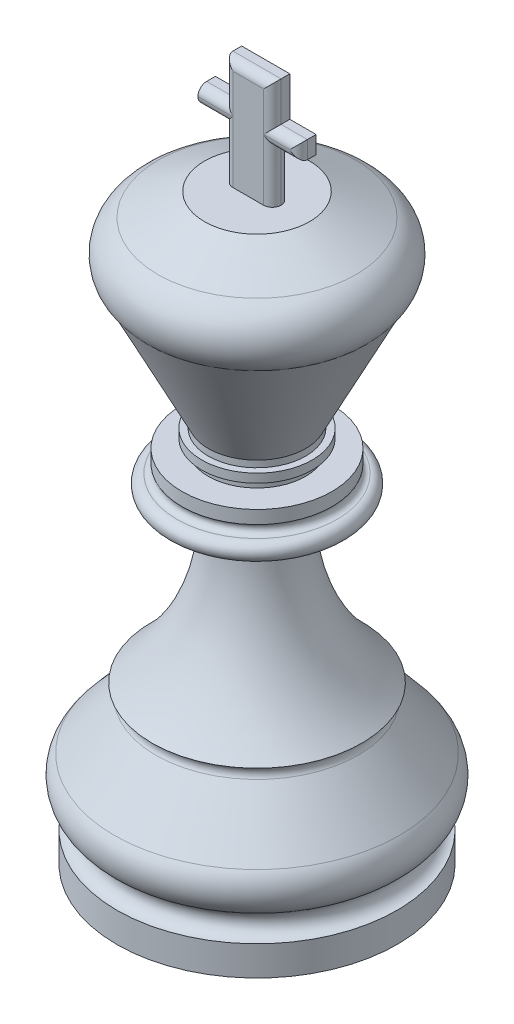
ISO-10303-21;
HEADER;
FILE_DESCRIPTION(('STEP AP214'),'2;1');
FILE_NAME('part.step','',(''),(''),'','','');
FILE_SCHEMA(('AUTOMOTIVE_DESIGN { 1 0 10303 214 1 1 1 1 }'));
ENDSEC;
DATA;
#1=APPLICATION_CONTEXT('core data for automotive mechanical design processes');
#2=APPLICATION_PROTOCOL_DEFINITION('international standard','automotive_design',2000,#1);
#3=PRODUCT_CONTEXT('',#1,'mechanical');
#4=PRODUCT('Part','Part','',(#3));
#5=PRODUCT_RELATED_PRODUCT_CATEGORY('part','',(#4));
#6=PRODUCT_DEFINITION_FORMATION('','',#4);
#7=PRODUCT_DEFINITION_CONTEXT('part definition',#1,'design');
#8=PRODUCT_DEFINITION('design','',#6,#7);
#9=PRODUCT_DEFINITION_SHAPE('','',#8);
#10=(LENGTH_UNIT() NAMED_UNIT(*) SI_UNIT(.MILLI.,.METRE.));
#11=(NAMED_UNIT(*) PLANE_ANGLE_UNIT() SI_UNIT($,.RADIAN.));
#12=(NAMED_UNIT(*) SI_UNIT($,.STERADIAN.) SOLID_ANGLE_UNIT());
#13=UNCERTAINTY_MEASURE_WITH_UNIT(LENGTH_MEASURE(1.E-05),#10,'distance_accuracy_value','');
#14=(GEOMETRIC_REPRESENTATION_CONTEXT(3) GLOBAL_UNCERTAINTY_ASSIGNED_CONTEXT((#13)) GLOBAL_UNIT_ASSIGNED_CONTEXT((#10,
#11,#12)) REPRESENTATION_CONTEXT('',''));
#15=CARTESIAN_POINT('',(0.,0.,0.));
#16=DIRECTION('',(0.,0.,1.));
#17=DIRECTION('',(1.,0.,0.));
#18=AXIS2_PLACEMENT_3D('',#15,#16,#17);
#19=CARTESIAN_POINT('',(0.,0.,0.));
#20=DIRECTION('',(0.,1.,0.));
#21=DIRECTION('',(0.,0.,1.));
#22=AXIS2_PLACEMENT_3D('',#19,#20,#21);
#23=PLANE('',#22);
#24=CARTESIAN_POINT('',(0.,0.,0.));
#25=DIRECTION('',(0.,1.,0.));
#26=DIRECTION('',(0.,0.,1.));
#27=AXIS2_PLACEMENT_3D('',#24,#25,#26);
#28=CIRCLE('',#27,16.);
#29=CARTESIAN_POINT('',(0.,0.,16.));
#30=VERTEX_POINT('',#29);
#31=EDGE_CURVE('E310',#30,#30,#28,.T.);
#32=ORIENTED_EDGE('',*,*,#31,.F.);
#33=EDGE_LOOP('',(#32));
#34=FACE_BOUND('',#33,.T.);
#35=ADVANCED_FACE('F35',(#34),#23,.F.);
#36=CARTESIAN_POINT('',(0.,88.0422171116666,0.));
#37=DIRECTION('',(0.,1.,0.));
#38=DIRECTION('',(0.,0.,1.));
#39=AXIS2_PLACEMENT_3D('',#36,#37,#38);
#40=CYLINDRICAL_SURFACE('',#39,16.);
#41=CARTESIAN_POINT('',(0.,3.38884097967218,0.));
#42=DIRECTION('',(0.,1.,0.));
#43=DIRECTION('',(0.,0.,1.));
#44=AXIS2_PLACEMENT_3D('',#41,#42,#43);
#45=CIRCLE('',#44,16.);
#46=CARTESIAN_POINT('',(0.,3.38884097967218,16.));
#47=VERTEX_POINT('',#46);
#48=EDGE_CURVE('E307',#47,#47,#45,.T.);
#49=ORIENTED_EDGE('',*,*,#48,.F.);
#50=EDGE_LOOP('',(#49));
#51=FACE_BOUND('',#50,.T.);
#52=ORIENTED_EDGE('',*,*,#31,.T.);
#53=EDGE_LOOP('',(#52));
#54=FACE_BOUND('',#53,.T.);
#55=ADVANCED_FACE('F428',(#51,#54),#40,.T.);
#56=CARTESIAN_POINT('',(0.,4.76051124191889,0.));
#57=DIRECTION('',(0.,1.,0.));
#58=DIRECTION('',(0.,0.,1.));
#59=AXIS2_PLACEMENT_3D('',#56,#57,#58);
#60=TOROIDAL_SURFACE('',#59,16.0005608776366,1.37167037691847);
#61=CARTESIAN_POINT('',(0.,5.96490883176661,0.));
#62=DIRECTION('',(0.,1.,0.));
#63=DIRECTION('',(0.,0.,1.));
#64=AXIS2_PLACEMENT_3D('',#61,#62,#63);
#65=CIRCLE('',#64,15.3441265180204);
#66=CARTESIAN_POINT('',(0.,5.96490883176661,15.3441265180204));
#67=VERTEX_POINT('',#66);
#68=EDGE_CURVE('E304',#67,#67,#65,.T.);
#69=ORIENTED_EDGE('',*,*,#68,.F.);
#70=EDGE_LOOP('',(#69));
#71=FACE_BOUND('',#70,.T.);
#72=ORIENTED_EDGE('',*,*,#48,.T.);
#73=EDGE_LOOP('',(#72));
#74=FACE_BOUND('',#73,.T.);
#75=ADVANCED_FACE('F434',(#71,#74),#60,.F.);
#76=CARTESIAN_POINT('',(0.,8.81872198418339,0.));
#77=DIRECTION('',(0.,1.,0.));
#78=DIRECTION('',(0.,0.,1.));
#79=AXIS2_PLACEMENT_3D('',#76,#77,#78);
#80=TOROIDAL_SURFACE('',#79,13.7887090836433,3.25016505797339);
#81=CARTESIAN_POINT('',(0.,10.9194362011423,0.));
#82=DIRECTION('',(0.,1.,0.));
#83=DIRECTION('',(0.,0.,1.));
#84=AXIS2_PLACEMENT_3D('',#81,#82,#83);
#85=CIRCLE('',#84,16.2687438984671);
#86=CARTESIAN_POINT('',(0.,10.9194362011423,16.2687438984671));
#87=VERTEX_POINT('',#86);
#88=EDGE_CURVE('E301',#87,#87,#85,.T.);
#89=ORIENTED_EDGE('',*,*,#88,.F.);
#90=EDGE_LOOP('',(#89));
#91=FACE_BOUND('',#90,.T.);
#92=ORIENTED_EDGE('',*,*,#68,.T.);
#93=EDGE_LOOP('',(#92));
#94=FACE_BOUND('',#93,.T.);
#95=ADVANCED_FACE('F653',(#91,#94),#80,.T.);
#96=CARTESIAN_POINT('',(0.,10.9194362011423,0.));
#97=DIRECTION('',(0.,-1.,0.));
#98=DIRECTION('',(0.,0.,-1.));
#99=AXIS2_PLACEMENT_3D('',#96,#97,#98);
#100=CONICAL_SURFACE('',#99,16.2687438984671,0.702779112860352);
#101=CARTESIAN_POINT('',(0.,16.4939069620984,0.));
#102=DIRECTION('',(0.,1.,0.));
#103=DIRECTION('',(0.,0.,1.));
#104=AXIS2_PLACEMENT_3D('',#101,#102,#103);
#105=CIRCLE('',#104,11.5468868061527);
#106=CARTESIAN_POINT('',(0.,16.4939069620984,11.5468868061527));
#107=VERTEX_POINT('',#106);
#108=EDGE_CURVE('E298',#107,#107,#105,.T.);
#109=ORIENTED_EDGE('',*,*,#108,.F.);
#110=EDGE_LOOP('',(#109));
#111=FACE_BOUND('',#110,.T.);
#112=ORIENTED_EDGE('',*,*,#88,.T.);
#113=EDGE_LOOP('',(#112));
#114=FACE_BOUND('',#113,.T.);
#115=ADVANCED_FACE('F649',(#111,#114),#100,.T.);
#116=CARTESIAN_POINT('',(0.,17.0521890788173,0.));
#117=DIRECTION('',(0.,1.,0.));
#118=DIRECTION('',(0.,0.,1.));
#119=AXIS2_PLACEMENT_3D('',#116,#117,#118);
#120=TOROIDAL_SURFACE('',#119,12.2575928339455,0.903759912692101);
#121=CARTESIAN_POINT('',(0.,17.9144675937287,0.));
#122=DIRECTION('',(0.,1.,0.));
#123=DIRECTION('',(0.,0.,1.));
#124=AXIS2_PLACEMENT_3D('',#121,#122,#123);
#125=CIRCLE('',#124,11.9869311585806);
#126=CARTESIAN_POINT('',(0.,17.9144675937287,11.9869311585806));
#127=VERTEX_POINT('',#126);
#128=EDGE_CURVE('E295',#127,#127,#125,.T.);
#129=ORIENTED_EDGE('',*,*,#128,.F.);
#130=EDGE_LOOP('',(#129));
#131=FACE_BOUND('',#130,.T.);
#132=ORIENTED_EDGE('',*,*,#108,.T.);
#133=EDGE_LOOP('',(#132));
#134=FACE_BOUND('',#133,.T.);
#135=ADVANCED_FACE('F645',(#131,#134),#120,.F.);
#136=CARTESIAN_POINT('',(0.,34.3485931344521,0.));
#137=DIRECTION('',(0.,1.,0.));
#138=DIRECTION('',(0.,0.,1.));
#139=AXIS2_PLACEMENT_3D('',#136,#137,#138);
#140=TOROIDAL_SURFACE('',#139,27.1403266869844,22.3541020470183);
#141=CARTESIAN_POINT('',(0.,36.5901221587112,0.));
#142=DIRECTION('',(0.,1.,0.));
#143=DIRECTION('',(0.,0.,1.));
#144=AXIS2_PLACEMENT_3D('',#141,#142,#143);
#145=CIRCLE('',#144,4.89889179707879);
#146=CARTESIAN_POINT('',(0.,36.5901221587112,4.89889179707879));
#147=VERTEX_POINT('',#146);
#148=EDGE_CURVE('E292',#147,#147,#145,.T.);
#149=ORIENTED_EDGE('',*,*,#148,.F.);
#150=EDGE_LOOP('',(#149));
#151=FACE_BOUND('',#150,.T.);
#152=ORIENTED_EDGE('',*,*,#128,.T.);
#153=EDGE_LOOP('',(#152));
#154=FACE_BOUND('',#153,.T.);
#155=ADVANCED_FACE('F641',(#151,#154),#140,.F.);
#156=CARTESIAN_POINT('',(9.14126090625646,36.5901221587112,0.));
#157=DIRECTION('',(0.,1.,0.));
#158=DIRECTION('',(0.,0.,1.));
#159=AXIS2_PLACEMENT_3D('',#156,#157,#158);
#160=PLANE('',#159);
#161=CARTESIAN_POINT('',(0.,36.5901221587112,0.));
#162=DIRECTION('',(0.,1.,0.));
#163=DIRECTION('',(0.,0.,1.));
#164=AXIS2_PLACEMENT_3D('',#161,#162,#163);
#165=CIRCLE('',#164,9.14126090625646);
#166=CARTESIAN_POINT('',(0.,36.5901221587112,9.14126090625646));
#167=VERTEX_POINT('',#166);
#168=EDGE_CURVE('E289',#167,#167,#165,.T.);
#169=ORIENTED_EDGE('',*,*,#168,.F.);
#170=EDGE_LOOP('',(#169));
#171=FACE_BOUND('',#170,.T.);
#172=ORIENTED_EDGE('',*,*,#148,.T.);
#173=EDGE_LOOP('',(#172));
#174=FACE_BOUND('',#173,.T.);
#175=ADVANCED_FACE('F637',(#171,#174),#160,.F.);
#176=CARTESIAN_POINT('',(0.,37.6051519059904,0.));
#177=DIRECTION('',(0.,1.,0.));
#178=DIRECTION('',(0.,0.,1.));
#179=AXIS2_PLACEMENT_3D('',#176,#177,#178);
#180=TOROIDAL_SURFACE('',#179,9.14126090625646,1.01502974727923);
#181=CARTESIAN_POINT('',(0.,38.6201816532696,0.));
#182=DIRECTION('',(0.,1.,0.));
#183=DIRECTION('',(0.,0.,1.));
#184=AXIS2_PLACEMENT_3D('',#181,#182,#183);
#185=CIRCLE('',#184,9.14126090625646);
#186=CARTESIAN_POINT('',(0.,38.6201816532696,9.14126090625646));
#187=VERTEX_POINT('',#186);
#188=EDGE_CURVE('E286',#187,#187,#185,.T.);
#189=ORIENTED_EDGE('',*,*,#188,.F.);
#190=EDGE_LOOP('',(#189));
#191=FACE_BOUND('',#190,.T.);
#192=ORIENTED_EDGE('',*,*,#168,.T.);
#193=EDGE_LOOP('',(#192));
#194=FACE_BOUND('',#193,.T.);
#195=ADVANCED_FACE('F633',(#191,#194),#180,.T.);
#196=CARTESIAN_POINT('',(0.,39.2468923614205,0.));
#197=DIRECTION('',(0.,1.,0.));
#198=DIRECTION('',(0.,0.,1.));
#199=AXIS2_PLACEMENT_3D('',#196,#197,#198);
#200=TOROIDAL_SURFACE('',#199,9.0913771794894,0.62869284862098);
#201=CARTESIAN_POINT('',(0.,39.5902225928148,0.));
#202=DIRECTION('',(0.,1.,0.));
#203=DIRECTION('',(0.,0.,1.));
#204=AXIS2_PLACEMENT_3D('',#201,#202,#203);
#205=CIRCLE('',#204,8.56470930490627);
#206=CARTESIAN_POINT('',(0.,39.5902225928148,8.56470930490627));
#207=VERTEX_POINT('',#206);
#208=EDGE_CURVE('E283',#207,#207,#205,.T.);
#209=ORIENTED_EDGE('',*,*,#208,.F.);
#210=EDGE_LOOP('',(#209));
#211=FACE_BOUND('',#210,.T.);
#212=ORIENTED_EDGE('',*,*,#188,.T.);
#213=EDGE_LOOP('',(#212));
#214=FACE_BOUND('',#213,.T.);
#215=ADVANCED_FACE('F629',(#211,#214),#200,.F.);
#216=CARTESIAN_POINT('',(0.,88.0422171116666,0.));
#217=DIRECTION('',(0.,1.,0.));
#218=DIRECTION('',(0.,0.,1.));
#219=AXIS2_PLACEMENT_3D('',#216,#217,#218);
#220=CYLINDRICAL_SURFACE('',#219,8.56470930490627);
#221=CARTESIAN_POINT('',(0.,41.0902225928148,0.));
#222=DIRECTION('',(0.,1.,0.));
#223=DIRECTION('',(0.,0.,1.));
#224=AXIS2_PLACEMENT_3D('',#221,#222,#223);
#225=CIRCLE('',#224,8.56470930490627);
#226=CARTESIAN_POINT('',(0.,41.0902225928148,8.56470930490627));
#227=VERTEX_POINT('',#226);
#228=EDGE_CURVE('E280',#227,#227,#225,.T.);
#229=ORIENTED_EDGE('',*,*,#228,.F.);
#230=EDGE_LOOP('',(#229));
#231=FACE_BOUND('',#230,.T.);
#232=ORIENTED_EDGE('',*,*,#208,.T.);
#233=EDGE_LOOP('',(#232));
#234=FACE_BOUND('',#233,.T.);
#235=ADVANCED_FACE('F625',(#231,#234),#220,.T.);
#236=CARTESIAN_POINT('',(5.56470930490627,41.0902225928148,0.));
#237=DIRECTION('',(0.,-1.,0.));
#238=DIRECTION('',(0.,0.,-1.));
#239=AXIS2_PLACEMENT_3D('',#236,#237,#238);
#240=PLANE('',#239);
#241=CARTESIAN_POINT('',(0.,41.0902225928148,0.));
#242=DIRECTION('',(0.,1.,0.));
#243=DIRECTION('',(0.,0.,1.));
#244=AXIS2_PLACEMENT_3D('',#241,#242,#243);
#245=CIRCLE('',#244,5.56470930490627);
#246=CARTESIAN_POINT('',(0.,41.0902225928148,5.56470930490627));
#247=VERTEX_POINT('',#246);
#248=EDGE_CURVE('E277',#247,#247,#245,.T.);
#249=ORIENTED_EDGE('',*,*,#248,.F.);
#250=EDGE_LOOP('',(#249));
#251=FACE_BOUND('',#250,.T.);
#252=ORIENTED_EDGE('',*,*,#228,.T.);
#253=EDGE_LOOP('',(#252));
#254=FACE_BOUND('',#253,.T.);
#255=ADVANCED_FACE('F621',(#251,#254),#240,.F.);
#256=CARTESIAN_POINT('',(0.,88.0422171116666,0.));
#257=DIRECTION('',(0.,1.,0.));
#258=DIRECTION('',(0.,0.,1.));
#259=AXIS2_PLACEMENT_3D('',#256,#257,#258);
#260=CYLINDRICAL_SURFACE('',#259,5.56470930490628);
#261=CARTESIAN_POINT('',(0.,42.0902225928148,0.));
#262=DIRECTION('',(0.,1.,0.));
#263=DIRECTION('',(0.,0.,1.));
#264=AXIS2_PLACEMENT_3D('',#261,#262,#263);
#265=CIRCLE('',#264,5.56470930490628);
#266=CARTESIAN_POINT('',(0.,42.0902225928148,5.56470930490628));
#267=VERTEX_POINT('',#266);
#268=EDGE_CURVE('E274',#267,#267,#265,.T.);
#269=ORIENTED_EDGE('',*,*,#268,.F.);
#270=EDGE_LOOP('',(#269));
#271=FACE_BOUND('',#270,.T.);
#272=ORIENTED_EDGE('',*,*,#248,.T.);
#273=EDGE_LOOP('',(#272));
#274=FACE_BOUND('',#273,.T.);
#275=ADVANCED_FACE('F617',(#271,#274),#260,.T.);
#276=CARTESIAN_POINT('',(6.31470930490628,42.0902225928148,0.));
#277=DIRECTION('',(0.,1.,0.));
#278=DIRECTION('',(0.,0.,1.));
#279=AXIS2_PLACEMENT_3D('',#276,#277,#278);
#280=PLANE('',#279);
#281=CARTESIAN_POINT('',(0.,42.0902225928148,0.));
#282=DIRECTION('',(0.,1.,0.));
#283=DIRECTION('',(0.,0.,1.));
#284=AXIS2_PLACEMENT_3D('',#281,#282,#283);
#285=CIRCLE('',#284,6.31470930490628);
#286=CARTESIAN_POINT('',(0.,42.0902225928148,6.31470930490628));
#287=VERTEX_POINT('',#286);
#288=EDGE_CURVE('E271',#287,#287,#285,.T.);
#289=ORIENTED_EDGE('',*,*,#288,.F.);
#290=EDGE_LOOP('',(#289));
#291=FACE_BOUND('',#290,.T.);
#292=ORIENTED_EDGE('',*,*,#268,.T.);
#293=EDGE_LOOP('',(#292));
#294=FACE_BOUND('',#293,.T.);
#295=ADVANCED_FACE('F613',(#291,#294),#280,.F.);
#296=CARTESIAN_POINT('',(0.,88.0422171116666,0.));
#297=DIRECTION('',(0.,1.,0.));
#298=DIRECTION('',(0.,0.,1.));
#299=AXIS2_PLACEMENT_3D('',#296,#297,#298);
#300=CYLINDRICAL_SURFACE('',#299,6.31470930490628);
#301=CARTESIAN_POINT('',(0.,43.0902225928148,0.));
#302=DIRECTION('',(0.,1.,0.));
#303=DIRECTION('',(0.,0.,1.));
#304=AXIS2_PLACEMENT_3D('',#301,#302,#303);
#305=CIRCLE('',#304,6.31470930490628);
#306=CARTESIAN_POINT('',(0.,43.0902225928148,6.31470930490628));
#307=VERTEX_POINT('',#306);
#308=EDGE_CURVE('E268',#307,#307,#305,.T.);
#309=ORIENTED_EDGE('',*,*,#308,.F.);
#310=EDGE_LOOP('',(#309));
#311=FACE_BOUND('',#310,.T.);
#312=ORIENTED_EDGE('',*,*,#288,.T.);
#313=EDGE_LOOP('',(#312));
#314=FACE_BOUND('',#313,.T.);
#315=ADVANCED_FACE('F609',(#311,#314),#300,.T.);
#316=CARTESIAN_POINT('',(5.56470930490628,43.0902225928148,0.));
#317=DIRECTION('',(0.,-1.,0.));
#318=DIRECTION('',(0.,0.,-1.));
#319=AXIS2_PLACEMENT_3D('',#316,#317,#318);
#320=PLANE('',#319);
#321=CARTESIAN_POINT('',(0.,43.0902225928148,0.));
#322=DIRECTION('',(0.,1.,0.));
#323=DIRECTION('',(0.,0.,1.));
#324=AXIS2_PLACEMENT_3D('',#321,#322,#323);
#325=CIRCLE('',#324,5.56470930490628);
#326=CARTESIAN_POINT('',(0.,43.0902225928148,5.56470930490628));
#327=VERTEX_POINT('',#326);
#328=EDGE_CURVE('E265',#327,#327,#325,.T.);
#329=ORIENTED_EDGE('',*,*,#328,.F.);
#330=EDGE_LOOP('',(#329));
#331=FACE_BOUND('',#330,.T.);
#332=ORIENTED_EDGE('',*,*,#308,.T.);
#333=EDGE_LOOP('',(#332));
#334=FACE_BOUND('',#333,.T.);
#335=ADVANCED_FACE('F605',(#331,#334),#320,.F.);
#336=CARTESIAN_POINT('',(0.,88.0422171116666,0.));
#337=DIRECTION('',(0.,1.,0.));
#338=DIRECTION('',(0.,0.,1.));
#339=AXIS2_PLACEMENT_3D('',#336,#337,#338);
#340=CYLINDRICAL_SURFACE('',#339,5.56470930490628);
#341=CARTESIAN_POINT('',(0.,43.8402225928148,0.));
#342=DIRECTION('',(0.,1.,0.));
#343=DIRECTION('',(0.,0.,1.));
#344=AXIS2_PLACEMENT_3D('',#341,#342,#343);
#345=CIRCLE('',#344,5.56470930490628);
#346=CARTESIAN_POINT('',(0.,43.8402225928148,5.56470930490628));
#347=VERTEX_POINT('',#346);
#348=EDGE_CURVE('E262',#347,#347,#345,.T.);
#349=ORIENTED_EDGE('',*,*,#348,.F.);
#350=EDGE_LOOP('',(#349));
#351=FACE_BOUND('',#350,.T.);
#352=ORIENTED_EDGE('',*,*,#328,.T.);
#353=EDGE_LOOP('',(#352));
#354=FACE_BOUND('',#353,.T.);
#355=ADVANCED_FACE('F601',(#351,#354),#340,.T.);
#356=CARTESIAN_POINT('',(0.,43.8402225928148,0.));
#357=DIRECTION('',(0.,1.,0.));
#358=DIRECTION('',(0.,0.,1.));
#359=AXIS2_PLACEMENT_3D('',#356,#357,#358);
#360=CONICAL_SURFACE('',#359,5.56470930490628,0.465375494081099);
#361=CARTESIAN_POINT('',(0.,57.550572976928,0.));
#362=DIRECTION('',(0.,1.,0.));
#363=DIRECTION('',(0.,0.,1.));
#364=AXIS2_PLACEMENT_3D('',#361,#362,#363);
#365=CIRCLE('',#364,12.4495225193497);
#366=CARTESIAN_POINT('',(0.,57.550572976928,12.4495225193497));
#367=VERTEX_POINT('',#366);
#368=EDGE_CURVE('E259',#367,#367,#365,.T.);
#369=ORIENTED_EDGE('',*,*,#368,.F.);
#370=EDGE_LOOP('',(#369));
#371=FACE_BOUND('',#370,.T.);
#372=ORIENTED_EDGE('',*,*,#348,.T.);
#373=EDGE_LOOP('',(#372));
#374=FACE_BOUND('',#373,.T.);
#375=ADVANCED_FACE('F597',(#371,#374),#360,.T.);
#376=CARTESIAN_POINT('',(0.,60.3214668250883,0.));
#377=DIRECTION('',(0.,1.,0.));
#378=DIRECTION('',(0.,0.,1.));
#379=AXIS2_PLACEMENT_3D('',#376,#377,#378);
#380=TOROIDAL_SURFACE('',#379,9.56470930490627,4.);
#381=CARTESIAN_POINT('',(0.,63.9194386847388,0.));
#382=DIRECTION('',(0.,1.,0.));
#383=DIRECTION('',(0.,0.,1.));
#384=AXIS2_PLACEMENT_3D('',#381,#382,#383);
#385=CIRCLE('',#384,11.3124502746047);
#386=CARTESIAN_POINT('',(0.,63.9194386847388,11.3124502746047));
#387=VERTEX_POINT('',#386);
#388=EDGE_CURVE('E256',#387,#387,#385,.T.);
#389=ORIENTED_EDGE('',*,*,#388,.F.);
#390=EDGE_LOOP('',(#389));
#391=FACE_BOUND('',#390,.T.);
#392=ORIENTED_EDGE('',*,*,#368,.T.);
#393=EDGE_LOOP('',(#392));
#394=FACE_BOUND('',#393,.T.);
#395=ADVANCED_FACE('F593',(#391,#394),#380,.T.);
#396=CARTESIAN_POINT('',(0.,63.9194386847388,0.));
#397=DIRECTION('',(0.,-1.,0.));
#398=DIRECTION('',(0.,0.,-1.));
#399=AXIS2_PLACEMENT_3D('',#396,#397,#398);
#400=CONICAL_SURFACE('',#399,11.3124502746047,1.1186076900031);
#401=CARTESIAN_POINT('',(0.,66.5,0.));
#402=DIRECTION('',(0.,1.,0.));
#403=DIRECTION('',(0.,0.,1.));
#404=AXIS2_PLACEMENT_3D('',#401,#402,#403);
#405=CIRCLE('',#404,6.);
#406=CARTESIAN_POINT('',(0.,66.5,6.));
#407=VERTEX_POINT('',#406);
#408=EDGE_CURVE('E228',#407,#407,#405,.T.);
#409=ORIENTED_EDGE('',*,*,#408,.F.);
#410=EDGE_LOOP('',(#409));
#411=FACE_BOUND('',#410,.T.);
#412=ORIENTED_EDGE('',*,*,#388,.T.);
#413=EDGE_LOOP('',(#412));
#414=FACE_BOUND('',#413,.T.);
#415=ADVANCED_FACE('F590',(#411,#414),#400,.T.);
#416=CARTESIAN_POINT('',(6.,66.5,0.));
#417=DIRECTION('',(0.,-1.,0.));
#418=DIRECTION('',(0.,0.,-1.));
#419=AXIS2_PLACEMENT_3D('',#416,#417,#418);
#420=PLANE('',#419);
#421=DIRECTION('',(1.,0.,0.));
#422=VECTOR('',#421,1.);
#423=CARTESIAN_POINT('',(-2.75,66.5,-1.));
#424=LINE('',#423,#422);
#425=CARTESIAN_POINT('',(-2.75,66.5,-1.));
#426=VERTEX_POINT('',#425);
#427=CARTESIAN_POINT('',(1.75,66.5,-1.));
#428=VERTEX_POINT('',#427);
#429=EDGE_CURVE('E214',#426,#428,#424,.T.);
#430=ORIENTED_EDGE('',*,*,#429,.T.);
#431=CARTESIAN_POINT('',(1.75,66.5,0.));
#432=DIRECTION('',(0.,-1.,0.));
#433=DIRECTION('',(0.,0.,-1.));
#434=AXIS2_PLACEMENT_3D('',#431,#432,#433);
#435=CIRCLE('',#434,1.);
#436=CARTESIAN_POINT('',(2.75,66.5,0.));
#437=VERTEX_POINT('',#436);
#438=EDGE_CURVE('E45',#428,#437,#435,.T.);
#439=ORIENTED_EDGE('',*,*,#438,.T.);
#440=CARTESIAN_POINT('',(1.75,66.5,0.));
#441=DIRECTION('',(0.,-1.,0.));
#442=DIRECTION('',(0.,0.,-1.));
#443=AXIS2_PLACEMENT_3D('',#440,#441,#442);
#444=CIRCLE('',#443,1.);
#445=CARTESIAN_POINT('',(1.75,66.5,1.));
#446=VERTEX_POINT('',#445);
#447=EDGE_CURVE('E11',#437,#446,#444,.T.);
#448=ORIENTED_EDGE('',*,*,#447,.T.);
#449=DIRECTION('',(1.,0.,0.));
#450=VECTOR('',#449,1.);
#451=CARTESIAN_POINT('',(-2.75,66.5,1.));
#452=LINE('',#451,#450);
#453=CARTESIAN_POINT('',(-1.75,66.5,1.));
#454=VERTEX_POINT('',#453);
#455=EDGE_CURVE('E187',#454,#446,#452,.T.);
#456=ORIENTED_EDGE('',*,*,#455,.F.);
#457=CARTESIAN_POINT('',(-1.75,66.5,0.));
#458=DIRECTION('',(0.,-1.,0.));
#459=DIRECTION('',(0.,0.,-1.));
#460=AXIS2_PLACEMENT_3D('',#457,#458,#459);
#461=CIRCLE('',#460,1.);
#462=CARTESIAN_POINT('',(-2.75,66.5,0.));
#463=VERTEX_POINT('',#462);
#464=EDGE_CURVE('E344',#454,#463,#461,.T.);
#465=ORIENTED_EDGE('',*,*,#464,.T.);
#466=DIRECTION('',(0.,0.,1.));
#467=VECTOR('',#466,1.);
#468=CARTESIAN_POINT('',(-2.75,66.5,-1.));
#469=LINE('',#468,#467);
#470=EDGE_CURVE('E235',#426,#463,#469,.T.);
#471=ORIENTED_EDGE('',*,*,#470,.F.);
#472=EDGE_LOOP('',(#430,#439,#448,#456,#465,#471));
#473=FACE_BOUND('',#472,.T.);
#474=ORIENTED_EDGE('',*,*,#408,.T.);
#475=EDGE_LOOP('',(#474));
#476=FACE_BOUND('',#475,.T.);
#477=ADVANCED_FACE('F405',(#473,#476),#420,.F.);
#478=CARTESIAN_POINT('',(2.75,74.5,-1.));
#479=DIRECTION('',(1.,0.,0.));
#480=DIRECTION('',(0.,1.,0.));
#481=AXIS2_PLACEMENT_3D('',#478,#479,#480);
#482=PLANE('',#481);
#483=DIRECTION('',(0.,0.,1.));
#484=VECTOR('',#483,1.);
#485=CARTESIAN_POINT('',(2.75,79.,-1.));
#486=LINE('',#485,#484);
#487=CARTESIAN_POINT('',(2.75,79.,-1.));
#488=VERTEX_POINT('',#487);
#489=CARTESIAN_POINT('',(2.75,79.,0.));
#490=VERTEX_POINT('',#489);
#491=EDGE_CURVE('E144',#488,#490,#486,.T.);
#492=ORIENTED_EDGE('',*,*,#491,.T.);
#493=DIRECTION('',(0.,1.,0.));
#494=VECTOR('',#493,1.);
#495=CARTESIAN_POINT('',(2.75,74.5,0.));
#496=LINE('',#495,#494);
#497=CARTESIAN_POINT('',(2.75,74.5,0.));
#498=VERTEX_POINT('',#497);
#499=EDGE_CURVE('E336',#490,#498,#496,.F.);
#500=ORIENTED_EDGE('',*,*,#499,.T.);
#501=DIRECTION('',(0.,0.,1.));
#502=VECTOR('',#501,1.);
#503=CARTESIAN_POINT('',(2.75,74.5,-1.));
#504=LINE('',#503,#502);
#505=CARTESIAN_POINT('',(2.75,74.5,-1.));
#506=VERTEX_POINT('',#505);
#507=EDGE_CURVE('E225',#506,#498,#504,.T.);
#508=ORIENTED_EDGE('',*,*,#507,.F.);
#509=DIRECTION('',(0.,1.,0.));
#510=VECTOR('',#509,1.);
#511=CARTESIAN_POINT('',(2.75,74.5,-1.));
#512=LINE('',#511,#510);
#513=EDGE_CURVE('E189',#506,#488,#512,.T.);
#514=ORIENTED_EDGE('',*,*,#513,.T.);
#515=EDGE_LOOP('',(#492,#500,#508,#514));
#516=FACE_BOUND('',#515,.T.);
#517=ADVANCED_FACE('F372',(#516),#482,.T.);
#518=CARTESIAN_POINT('',(5.75,74.5,-1.));
#519=DIRECTION('',(0.,1.,0.));
#520=DIRECTION('',(0.,0.,1.));
#521=AXIS2_PLACEMENT_3D('',#518,#519,#520);
#522=PLANE('',#521);
#523=ORIENTED_EDGE('',*,*,#507,.T.);
#524=DIRECTION('',(-1.,0.,0.));
#525=VECTOR('',#524,1.);
#526=CARTESIAN_POINT('',(5.75,74.5,0.));
#527=LINE('',#526,#525);
#528=CARTESIAN_POINT('',(5.75,74.5,0.));
#529=VERTEX_POINT('',#528);
#530=EDGE_CURVE('E338',#498,#529,#527,.F.);
#531=ORIENTED_EDGE('',*,*,#530,.T.);
#532=DIRECTION('',(0.,0.,1.));
#533=VECTOR('',#532,1.);
#534=CARTESIAN_POINT('',(5.75,74.5,-1.));
#535=LINE('',#534,#533);
#536=CARTESIAN_POINT('',(5.75,74.5,-1.));
#537=VERTEX_POINT('',#536);
#538=EDGE_CURVE('E229',#537,#529,#535,.T.);
#539=ORIENTED_EDGE('',*,*,#538,.F.);
#540=DIRECTION('',(-1.,0.,0.));
#541=VECTOR('',#540,1.);
#542=CARTESIAN_POINT('',(5.75,74.5,-1.));
#543=LINE('',#542,#541);
#544=EDGE_CURVE('E222',#537,#506,#543,.T.);
#545=ORIENTED_EDGE('',*,*,#544,.T.);
#546=EDGE_LOOP('',(#523,#531,#539,#545));
#547=FACE_BOUND('',#546,.T.);
#548=ADVANCED_FACE('F375',(#547),#522,.T.);
#549=CARTESIAN_POINT('',(5.75,72.5,-1.));
#550=DIRECTION('',(1.,0.,0.));
#551=DIRECTION('',(0.,0.,-1.));
#552=AXIS2_PLACEMENT_3D('',#549,#550,#551);
#553=PLANE('',#552);
#554=ORIENTED_EDGE('',*,*,#538,.T.);
#555=DIRECTION('',(0.,1.,0.));
#556=VECTOR('',#555,1.);
#557=CARTESIAN_POINT('',(5.75,72.5,0.));
#558=LINE('',#557,#556);
#559=CARTESIAN_POINT('',(5.75,72.5,0.));
#560=VERTEX_POINT('',#559);
#561=EDGE_CURVE('E165',#529,#560,#558,.F.);
#562=ORIENTED_EDGE('',*,*,#561,.T.);
#563=DIRECTION('',(0.,0.,1.));
#564=VECTOR('',#563,1.);
#565=CARTESIAN_POINT('',(5.75,72.5,-1.));
#566=LINE('',#565,#564);
#567=CARTESIAN_POINT('',(5.75,72.5,-1.));
#568=VERTEX_POINT('',#567);
#569=EDGE_CURVE('E232',#568,#560,#566,.T.);
#570=ORIENTED_EDGE('',*,*,#569,.F.);
#571=DIRECTION('',(0.,1.,0.));
#572=VECTOR('',#571,1.);
#573=CARTESIAN_POINT('',(5.75,72.5,-1.));
#574=LINE('',#573,#572);
#575=EDGE_CURVE('E219',#568,#537,#574,.T.);
#576=ORIENTED_EDGE('',*,*,#575,.T.);
#577=EDGE_LOOP('',(#554,#562,#570,#576));
#578=FACE_BOUND('',#577,.T.);
#579=ADVANCED_FACE('F472',(#578),#553,.T.);
#580=CARTESIAN_POINT('',(2.75,72.5,-1.));
#581=DIRECTION('',(0.,-1.,0.));
#582=DIRECTION('',(1.,0.,0.));
#583=AXIS2_PLACEMENT_3D('',#580,#581,#582);
#584=PLANE('',#583);
#585=ORIENTED_EDGE('',*,*,#569,.T.);
#586=DIRECTION('',(1.,0.,0.));
#587=VECTOR('',#586,1.);
#588=CARTESIAN_POINT('',(2.75,72.5,0.));
#589=LINE('',#588,#587);
#590=CARTESIAN_POINT('',(2.75,72.5,0.));
#591=VERTEX_POINT('',#590);
#592=EDGE_CURVE('E158',#560,#591,#589,.F.);
#593=ORIENTED_EDGE('',*,*,#592,.T.);
#594=CARTESIAN_POINT('',(1.75,72.5,0.));
#595=DIRECTION('',(0.,-1.,0.));
#596=DIRECTION('',(1.,0.,0.));
#597=AXIS2_PLACEMENT_3D('',#594,#595,#596);
#598=CIRCLE('',#597,1.);
#599=CARTESIAN_POINT('',(1.75,72.5,-1.));
#600=VERTEX_POINT('',#599);
#601=EDGE_CURVE('E346',#591,#600,#598,.F.);
#602=ORIENTED_EDGE('',*,*,#601,.T.);
#603=DIRECTION('',(1.,0.,0.));
#604=VECTOR('',#603,1.);
#605=CARTESIAN_POINT('',(2.75,72.5,-1.));
#606=LINE('',#605,#604);
#607=EDGE_CURVE('E216',#600,#568,#606,.T.);
#608=ORIENTED_EDGE('',*,*,#607,.T.);
#609=EDGE_LOOP('',(#585,#593,#602,#608));
#610=FACE_BOUND('',#609,.T.);
#611=ADVANCED_FACE('F475',(#610),#584,.T.);
#612=CARTESIAN_POINT('',(-2.75,66.5,-1.));
#613=DIRECTION('',(-1.,0.,0.));
#614=DIRECTION('',(0.,-1.,0.));
#615=AXIS2_PLACEMENT_3D('',#612,#613,#614);
#616=PLANE('',#615);
#617=ORIENTED_EDGE('',*,*,#470,.T.);
#618=DIRECTION('',(0.,-1.,0.));
#619=VECTOR('',#618,1.);
#620=CARTESIAN_POINT('',(-2.75,72.5,0.));
#621=LINE('',#620,#619);
#622=CARTESIAN_POINT('',(-2.75,72.5,0.));
#623=VERTEX_POINT('',#622);
#624=EDGE_CURVE('E322',#463,#623,#621,.F.);
#625=ORIENTED_EDGE('',*,*,#624,.T.);
#626=DIRECTION('',(0.,0.,1.));
#627=VECTOR('',#626,1.);
#628=CARTESIAN_POINT('',(-2.75,72.5,-1.));
#629=LINE('',#628,#627);
#630=CARTESIAN_POINT('',(-2.75,72.5,-1.));
#631=VERTEX_POINT('',#630);
#632=EDGE_CURVE('E238',#631,#623,#629,.T.);
#633=ORIENTED_EDGE('',*,*,#632,.F.);
#634=DIRECTION('',(0.,-1.,0.));
#635=VECTOR('',#634,1.);
#636=CARTESIAN_POINT('',(-2.75,66.5,-1.));
#637=LINE('',#636,#635);
#638=EDGE_CURVE('E211',#631,#426,#637,.T.);
#639=ORIENTED_EDGE('',*,*,#638,.T.);
#640=EDGE_LOOP('',(#617,#625,#633,#639));
#641=FACE_BOUND('',#640,.T.);
#642=ADVANCED_FACE('F409',(#641),#616,.T.);
#643=CARTESIAN_POINT('',(-2.75,72.5,-1.));
#644=DIRECTION('',(0.,-1.,0.));
#645=DIRECTION('',(0.,0.,-1.));
#646=AXIS2_PLACEMENT_3D('',#643,#644,#645);
#647=PLANE('',#646);
#648=ORIENTED_EDGE('',*,*,#632,.T.);
#649=DIRECTION('',(1.,0.,0.));
#650=VECTOR('',#649,1.);
#651=CARTESIAN_POINT('',(-5.75,72.5,0.));
#652=LINE('',#651,#650);
#653=CARTESIAN_POINT('',(-5.75,72.5,0.));
#654=VERTEX_POINT('',#653);
#655=EDGE_CURVE('E324',#623,#654,#652,.F.);
#656=ORIENTED_EDGE('',*,*,#655,.T.);
#657=DIRECTION('',(0.,0.,1.));
#658=VECTOR('',#657,1.);
#659=CARTESIAN_POINT('',(-5.75,72.5,-1.));
#660=LINE('',#659,#658);
#661=CARTESIAN_POINT('',(-5.75,72.5,-1.));
#662=VERTEX_POINT('',#661);
#663=EDGE_CURVE('E241',#662,#654,#660,.T.);
#664=ORIENTED_EDGE('',*,*,#663,.F.);
#665=DIRECTION('',(1.,0.,0.));
#666=VECTOR('',#665,1.);
#667=CARTESIAN_POINT('',(-2.75,72.5,-1.));
#668=LINE('',#667,#666);
#669=EDGE_CURVE('E208',#662,#631,#668,.T.);
#670=ORIENTED_EDGE('',*,*,#669,.T.);
#671=EDGE_LOOP('',(#648,#656,#664,#670));
#672=FACE_BOUND('',#671,.T.);
#673=ADVANCED_FACE('F414',(#672),#647,.T.);
#674=CARTESIAN_POINT('',(-5.75,72.5,-1.));
#675=DIRECTION('',(-1.,0.,0.));
#676=DIRECTION('',(0.,0.,1.));
#677=AXIS2_PLACEMENT_3D('',#674,#675,#676);
#678=PLANE('',#677);
#679=ORIENTED_EDGE('',*,*,#663,.T.);
#680=CARTESIAN_POINT('',(-5.75,73.5,0.));
#681=DIRECTION('',(-1.,0.,0.));
#682=DIRECTION('',(0.,0.,1.));
#683=AXIS2_PLACEMENT_3D('',#680,#681,#682);
#684=CIRCLE('',#683,1.);
#685=CARTESIAN_POINT('',(-5.75,73.5,1.));
#686=VERTEX_POINT('',#685);
#687=EDGE_CURVE('E328',#654,#686,#684,.T.);
#688=ORIENTED_EDGE('',*,*,#687,.T.);
#689=CARTESIAN_POINT('',(-5.75,73.5,0.));
#690=DIRECTION('',(-1.,0.,0.));
#691=DIRECTION('',(0.,0.,1.));
#692=AXIS2_PLACEMENT_3D('',#689,#690,#691);
#693=CIRCLE('',#692,1.);
#694=CARTESIAN_POINT('',(-5.75,74.5,0.));
#695=VERTEX_POINT('',#694);
#696=EDGE_CURVE('E326',#686,#695,#693,.T.);
#697=ORIENTED_EDGE('',*,*,#696,.T.);
#698=DIRECTION('',(0.,0.,1.));
#699=VECTOR('',#698,1.);
#700=CARTESIAN_POINT('',(-5.75,74.5,-1.));
#701=LINE('',#700,#699);
#702=CARTESIAN_POINT('',(-5.75,74.5,-1.));
#703=VERTEX_POINT('',#702);
#704=EDGE_CURVE('E244',#703,#695,#701,.T.);
#705=ORIENTED_EDGE('',*,*,#704,.F.);
#706=DIRECTION('',(0.,-1.,0.));
#707=VECTOR('',#706,1.);
#708=CARTESIAN_POINT('',(-5.75,72.5,-1.));
#709=LINE('',#708,#707);
#710=EDGE_CURVE('E205',#703,#662,#709,.T.);
#711=ORIENTED_EDGE('',*,*,#710,.T.);
#712=EDGE_LOOP('',(#679,#688,#697,#705,#711));
#713=FACE_BOUND('',#712,.T.);
#714=ADVANCED_FACE('F416',(#713),#678,.T.);
#715=CARTESIAN_POINT('',(-5.75,74.5,-1.));
#716=DIRECTION('',(0.,1.,0.));
#717=DIRECTION('',(0.,0.,1.));
#718=AXIS2_PLACEMENT_3D('',#715,#716,#717);
#719=PLANE('',#718);
#720=ORIENTED_EDGE('',*,*,#704,.T.);
#721=DIRECTION('',(-1.,0.,0.));
#722=VECTOR('',#721,1.);
#723=CARTESIAN_POINT('',(-2.75,74.5,0.));
#724=LINE('',#723,#722);
#725=CARTESIAN_POINT('',(-2.75,74.5,0.));
#726=VERTEX_POINT('',#725);
#727=EDGE_CURVE('E330',#695,#726,#724,.F.);
#728=ORIENTED_EDGE('',*,*,#727,.T.);
#729=DIRECTION('',(0.,0.,1.));
#730=VECTOR('',#729,1.);
#731=CARTESIAN_POINT('',(-2.75,74.5,-1.));
#732=LINE('',#731,#730);
#733=CARTESIAN_POINT('',(-2.75,74.5,-1.));
#734=VERTEX_POINT('',#733);
#735=EDGE_CURVE('E247',#734,#726,#732,.T.);
#736=ORIENTED_EDGE('',*,*,#735,.F.);
#737=DIRECTION('',(-1.,0.,0.));
#738=VECTOR('',#737,1.);
#739=CARTESIAN_POINT('',(-5.75,74.5,-1.));
#740=LINE('',#739,#738);
#741=EDGE_CURVE('E202',#734,#703,#740,.T.);
#742=ORIENTED_EDGE('',*,*,#741,.T.);
#743=EDGE_LOOP('',(#720,#728,#736,#742));
#744=FACE_BOUND('',#743,.T.);
#745=ADVANCED_FACE('F418',(#744),#719,.T.);
#746=CARTESIAN_POINT('',(-2.75,74.5,-1.));
#747=DIRECTION('',(-1.,0.,0.));
#748=DIRECTION('',(0.,0.,1.));
#749=AXIS2_PLACEMENT_3D('',#746,#747,#748);
#750=PLANE('',#749);
#751=ORIENTED_EDGE('',*,*,#735,.T.);
#752=DIRECTION('',(0.,-1.,0.));
#753=VECTOR('',#752,1.);
#754=CARTESIAN_POINT('',(-2.75,79.,0.));
#755=LINE('',#754,#753);
#756=CARTESIAN_POINT('',(-2.75,79.,0.));
#757=VERTEX_POINT('',#756);
#758=EDGE_CURVE('E332',#726,#757,#755,.F.);
#759=ORIENTED_EDGE('',*,*,#758,.T.);
#760=DIRECTION('',(0.,0.,1.));
#761=VECTOR('',#760,1.);
#762=CARTESIAN_POINT('',(-2.75,79.,-1.));
#763=LINE('',#762,#761);
#764=CARTESIAN_POINT('',(-2.75,79.,-1.));
#765=VERTEX_POINT('',#764);
#766=EDGE_CURVE('E250',#765,#757,#763,.T.);
#767=ORIENTED_EDGE('',*,*,#766,.F.);
#768=DIRECTION('',(0.,-1.,0.));
#769=VECTOR('',#768,1.);
#770=CARTESIAN_POINT('',(-2.75,74.5,-1.));
#771=LINE('',#770,#769);
#772=EDGE_CURVE('E199',#765,#734,#771,.T.);
#773=ORIENTED_EDGE('',*,*,#772,.T.);
#774=EDGE_LOOP('',(#751,#759,#767,#773));
#775=FACE_BOUND('',#774,.T.);
#776=ADVANCED_FACE('F384',(#775),#750,.T.);
#777=CARTESIAN_POINT('',(-2.75,79.,-1.));
#778=DIRECTION('',(0.,1.,0.));
#779=DIRECTION('',(0.,0.,1.));
#780=AXIS2_PLACEMENT_3D('',#777,#778,#779);
#781=PLANE('',#780);
#782=ORIENTED_EDGE('',*,*,#766,.T.);
#783=DIRECTION('',(-1.,0.,0.));
#784=VECTOR('',#783,1.);
#785=CARTESIAN_POINT('',(2.75,79.,0.));
#786=LINE('',#785,#784);
#787=EDGE_CURVE('E334',#757,#490,#786,.F.);
#788=ORIENTED_EDGE('',*,*,#787,.T.);
#789=ORIENTED_EDGE('',*,*,#491,.F.);
#790=DIRECTION('',(-1.,0.,0.));
#791=VECTOR('',#790,1.);
#792=CARTESIAN_POINT('',(-2.75,79.,-1.));
#793=LINE('',#792,#791);
#794=EDGE_CURVE('E195',#488,#765,#793,.T.);
#795=ORIENTED_EDGE('',*,*,#794,.T.);
#796=EDGE_LOOP('',(#782,#788,#789,#795));
#797=FACE_BOUND('',#796,.T.);
#798=ADVANCED_FACE('F382',(#797),#781,.T.);
#799=CARTESIAN_POINT('',(0.,0.,-1.));
#800=DIRECTION('',(0.,0.,-1.));
#801=DIRECTION('',(-1.,0.,0.));
#802=AXIS2_PLACEMENT_3D('',#799,#800,#801);
#803=PLANE('',#802);
#804=ORIENTED_EDGE('',*,*,#607,.F.);
#805=DIRECTION('',(0.,1.,0.));
#806=VECTOR('',#805,1.);
#807=CARTESIAN_POINT('',(1.75000000000001,0.,-1.));
#808=LINE('',#807,#806);
#809=EDGE_CURVE('E342',#600,#428,#808,.F.);
#810=ORIENTED_EDGE('',*,*,#809,.T.);
#811=ORIENTED_EDGE('',*,*,#429,.F.);
#812=ORIENTED_EDGE('',*,*,#638,.F.);
#813=ORIENTED_EDGE('',*,*,#669,.F.);
#814=ORIENTED_EDGE('',*,*,#710,.F.);
#815=ORIENTED_EDGE('',*,*,#741,.F.);
#816=ORIENTED_EDGE('',*,*,#772,.F.);
#817=ORIENTED_EDGE('',*,*,#794,.F.);
#818=ORIENTED_EDGE('',*,*,#513,.F.);
#819=ORIENTED_EDGE('',*,*,#544,.F.);
#820=ORIENTED_EDGE('',*,*,#575,.F.);
#821=EDGE_LOOP('',(#804,#810,#811,#812,#813,#814,#815,#816,#817,#818,#819,#820));
#822=FACE_BOUND('',#821,.T.);
#823=ADVANCED_FACE('F379',(#822),#803,.T.);
#824=CARTESIAN_POINT('',(0.,0.,1.));
#825=DIRECTION('',(0.,0.,-1.));
#826=DIRECTION('',(-1.,0.,0.));
#827=AXIS2_PLACEMENT_3D('',#824,#825,#826);
#828=PLANE('',#827);
#829=DIRECTION('',(0.,-1.,0.));
#830=VECTOR('',#829,1.);
#831=CARTESIAN_POINT('',(-1.75,74.5,1.));
#832=LINE('',#831,#830);
#833=CARTESIAN_POINT('',(-1.75,78.,1.));
#834=VERTEX_POINT('',#833);
#835=CARTESIAN_POINT('',(-1.75,73.5,1.));
#836=VERTEX_POINT('',#835);
#837=EDGE_CURVE('E318',#834,#836,#832,.T.);
#838=ORIENTED_EDGE('',*,*,#837,.T.);
#839=DIRECTION('',(0.,-1.,0.));
#840=VECTOR('',#839,1.);
#841=CARTESIAN_POINT('',(-1.75,66.5,1.));
#842=LINE('',#841,#840);
#843=EDGE_CURVE('E320',#836,#454,#842,.T.);
#844=ORIENTED_EDGE('',*,*,#843,.T.);
#845=ORIENTED_EDGE('',*,*,#455,.T.);
#846=DIRECTION('',(0.,1.,0.));
#847=VECTOR('',#846,1.);
#848=CARTESIAN_POINT('',(1.75,72.5,1.));
#849=LINE('',#848,#847);
#850=CARTESIAN_POINT('',(1.75,73.5,1.));
#851=VERTEX_POINT('',#850);
#852=EDGE_CURVE('E184',#446,#851,#849,.T.);
#853=ORIENTED_EDGE('',*,*,#852,.T.);
#854=DIRECTION('',(0.,1.,0.));
#855=VECTOR('',#854,1.);
#856=CARTESIAN_POINT('',(1.75,79.,1.));
#857=LINE('',#856,#855);
#858=CARTESIAN_POINT('',(1.75,78.,1.));
#859=VERTEX_POINT('',#858);
#860=EDGE_CURVE('E314',#851,#859,#857,.T.);
#861=ORIENTED_EDGE('',*,*,#860,.T.);
#862=DIRECTION('',(-1.,0.,0.));
#863=VECTOR('',#862,1.);
#864=CARTESIAN_POINT('',(-2.75,78.,1.));
#865=LINE('',#864,#863);
#866=EDGE_CURVE('E316',#859,#834,#865,.T.);
#867=ORIENTED_EDGE('',*,*,#866,.T.);
#868=EDGE_LOOP('',(#838,#844,#845,#853,#861,#867));
#869=FACE_BOUND('',#868,.T.);
#870=ADVANCED_FACE('F404',(#869),#828,.F.);
#871=CARTESIAN_POINT('',(1.75,66.5,0.));
#872=DIRECTION('',(0.,1.,0.));
#873=DIRECTION('',(-1.,0.,0.));
#874=AXIS2_PLACEMENT_3D('',#871,#872,#873);
#875=CYLINDRICAL_SURFACE('',#874,1.);
#876=DIRECTION('',(0.,1.,0.));
#877=VECTOR('',#876,1.);
#878=CARTESIAN_POINT('',(2.75,66.5,0.));
#879=LINE('',#878,#877);
#880=EDGE_CURVE('E39',#437,#591,#879,.T.);
#881=ORIENTED_EDGE('',*,*,#880,.F.);
#882=ORIENTED_EDGE('',*,*,#438,.F.);
#883=ORIENTED_EDGE('',*,*,#809,.F.);
#884=ORIENTED_EDGE('',*,*,#601,.F.);
#885=EDGE_LOOP('',(#881,#882,#883,#884));
#886=FACE_BOUND('',#885,.T.);
#887=ADVANCED_FACE('F37',(#886),#875,.T.);
#888=CARTESIAN_POINT('',(1.75000000000001,0.,0.));
#889=DIRECTION('',(0.,-1.,0.));
#890=DIRECTION('',(1.,0.,0.));
#891=AXIS2_PLACEMENT_3D('',#888,#889,#890);
#892=CYLINDRICAL_SURFACE('',#891,1.);
#893=ORIENTED_EDGE('',*,*,#447,.F.);
#894=ORIENTED_EDGE('',*,*,#880,.T.);
#895=CARTESIAN_POINT('',(1.75,73.5,0.));
#896=DIRECTION('',(-0.707106781186549,-0.707106781186546,0.));
#897=DIRECTION('',(-0.707106781186546,0.707106781186549,0.));
#898=AXIS2_PLACEMENT_3D('',#895,#896,#897);
#899=ELLIPSE('',#898,1.4142135623731,1.);
#900=EDGE_CURVE('E161',#851,#591,#899,.F.);
#901=ORIENTED_EDGE('',*,*,#900,.F.);
#902=ORIENTED_EDGE('',*,*,#852,.F.);
#903=EDGE_LOOP('',(#893,#894,#901,#902));
#904=FACE_BOUND('',#903,.T.);
#905=ADVANCED_FACE('F183',(#904),#892,.T.);
#906=CARTESIAN_POINT('',(4.75,0.,0.));
#907=DIRECTION('',(0.,-1.,0.));
#908=DIRECTION('',(0.,0.,-1.));
#909=AXIS2_PLACEMENT_3D('',#906,#907,#908);
#910=CYLINDRICAL_SURFACE('',#909,1.);
#911=CARTESIAN_POINT('',(4.75,73.5,0.));
#912=DIRECTION('',(-0.707106781186549,-0.707106781186546,0.));
#913=DIRECTION('',(-0.707106781186546,0.707106781186549,0.));
#914=AXIS2_PLACEMENT_3D('',#911,#912,#913);
#915=ELLIPSE('',#914,1.4142135623731,1.);
#916=CARTESIAN_POINT('',(4.75,73.5,1.));
#917=VERTEX_POINT('',#916);
#918=EDGE_CURVE('E151',#560,#917,#915,.T.);
#919=ORIENTED_EDGE('',*,*,#918,.F.);
#920=ORIENTED_EDGE('',*,*,#561,.F.);
#921=CARTESIAN_POINT('',(4.75,73.5,0.));
#922=DIRECTION('',(0.707106781186547,-0.707106781186547,0.));
#923=DIRECTION('',(-0.707106781186547,-0.707106781186547,0.));
#924=AXIS2_PLACEMENT_3D('',#921,#922,#923);
#925=ELLIPSE('',#924,1.41421356237309,1.);
#926=EDGE_CURVE('E163',#917,#529,#925,.F.);
#927=ORIENTED_EDGE('',*,*,#926,.F.);
#928=EDGE_LOOP('',(#919,#920,#927));
#929=FACE_BOUND('',#928,.T.);
#930=ADVANCED_FACE('F164',(#929),#910,.T.);
#931=CARTESIAN_POINT('',(3.40005801291454E-13,73.5,0.));
#932=DIRECTION('',(-1.,0.,0.));
#933=DIRECTION('',(0.,-1.,0.));
#934=AXIS2_PLACEMENT_3D('',#931,#932,#933);
#935=CYLINDRICAL_SURFACE('',#934,1.);
#936=ORIENTED_EDGE('',*,*,#592,.F.);
#937=ORIENTED_EDGE('',*,*,#918,.T.);
#938=DIRECTION('',(1.,0.,0.));
#939=VECTOR('',#938,1.);
#940=CARTESIAN_POINT('',(5.75,73.5,1.));
#941=LINE('',#940,#939);
#942=EDGE_CURVE('E156',#851,#917,#941,.T.);
#943=ORIENTED_EDGE('',*,*,#942,.F.);
#944=ORIENTED_EDGE('',*,*,#900,.T.);
#945=EDGE_LOOP('',(#936,#937,#943,#944));
#946=FACE_BOUND('',#945,.T.);
#947=ADVANCED_FACE('F153',(#946),#935,.T.);
#948=CARTESIAN_POINT('',(0.,73.5,0.));
#949=DIRECTION('',(1.,0.,0.));
#950=DIRECTION('',(0.,0.,-1.));
#951=AXIS2_PLACEMENT_3D('',#948,#949,#950);
#952=CYLINDRICAL_SURFACE('',#951,1.);
#953=ORIENTED_EDGE('',*,*,#926,.T.);
#954=ORIENTED_EDGE('',*,*,#530,.F.);
#955=CARTESIAN_POINT('',(1.75,73.5,0.));
#956=DIRECTION('',(0.707106781186547,-0.707106781186548,0.));
#957=DIRECTION('',(-0.707106781186548,-0.707106781186547,0.));
#958=AXIS2_PLACEMENT_3D('',#955,#956,#957);
#959=ELLIPSE('',#958,1.4142135623731,1.);
#960=EDGE_CURVE('E171',#851,#498,#959,.F.);
#961=ORIENTED_EDGE('',*,*,#960,.F.);
#962=ORIENTED_EDGE('',*,*,#942,.T.);
#963=EDGE_LOOP('',(#953,#954,#961,#962));
#964=FACE_BOUND('',#963,.T.);
#965=ADVANCED_FACE('F169',(#964),#952,.T.);
#966=CARTESIAN_POINT('',(1.74999999999999,0.,0.));
#967=DIRECTION('',(0.,-1.,0.));
#968=DIRECTION('',(1.,0.,0.));
#969=AXIS2_PLACEMENT_3D('',#966,#967,#968);
#970=CYLINDRICAL_SURFACE('',#969,1.);
#971=ORIENTED_EDGE('',*,*,#960,.T.);
#972=ORIENTED_EDGE('',*,*,#499,.F.);
#973=CARTESIAN_POINT('',(1.75,78.,0.));
#974=DIRECTION('',(0.707106781186547,-0.707106781186548,0.));
#975=DIRECTION('',(-0.707106781186548,-0.707106781186547,0.));
#976=AXIS2_PLACEMENT_3D('',#973,#974,#975);
#977=ELLIPSE('',#976,1.4142135623731,1.);
#978=EDGE_CURVE('E174',#859,#490,#977,.F.);
#979=ORIENTED_EDGE('',*,*,#978,.F.);
#980=ORIENTED_EDGE('',*,*,#860,.F.);
#981=EDGE_LOOP('',(#971,#972,#979,#980));
#982=FACE_BOUND('',#981,.T.);
#983=ADVANCED_FACE('F370',(#982),#970,.T.);
#984=CARTESIAN_POINT('',(0.,78.,0.));
#985=DIRECTION('',(1.,0.,0.));
#986=DIRECTION('',(0.,0.,-1.));
#987=AXIS2_PLACEMENT_3D('',#984,#985,#986);
#988=CYLINDRICAL_SURFACE('',#987,1.);
#989=ORIENTED_EDGE('',*,*,#978,.T.);
#990=ORIENTED_EDGE('',*,*,#787,.F.);
#991=CARTESIAN_POINT('',(-1.75,78.,0.));
#992=DIRECTION('',(0.707106781186547,0.707106781186547,0.));
#993=DIRECTION('',(0.707106781186547,-0.707106781186547,0.));
#994=AXIS2_PLACEMENT_3D('',#991,#992,#993);
#995=ELLIPSE('',#994,1.41421356237309,1.);
#996=EDGE_CURVE('E359',#834,#757,#995,.F.);
#997=ORIENTED_EDGE('',*,*,#996,.F.);
#998=ORIENTED_EDGE('',*,*,#866,.F.);
#999=EDGE_LOOP('',(#989,#990,#997,#998));
#1000=FACE_BOUND('',#999,.T.);
#1001=ADVANCED_FACE('F366',(#1000),#988,.T.);
#1002=CARTESIAN_POINT('',(-1.75,0.,0.));
#1003=DIRECTION('',(0.,1.,0.));
#1004=DIRECTION('',(0.,0.,1.));
#1005=AXIS2_PLACEMENT_3D('',#1002,#1003,#1004);
#1006=CYLINDRICAL_SURFACE('',#1005,1.);
#1007=ORIENTED_EDGE('',*,*,#996,.T.);
#1008=ORIENTED_EDGE('',*,*,#758,.F.);
#1009=CARTESIAN_POINT('',(-1.75,73.5,0.));
#1010=DIRECTION('',(0.707106781186547,0.707106781186547,0.));
#1011=DIRECTION('',(0.707106781186547,-0.707106781186547,0.));
#1012=AXIS2_PLACEMENT_3D('',#1009,#1010,#1011);
#1013=ELLIPSE('',#1012,1.41421356237309,1.);
#1014=EDGE_CURVE('E356',#836,#726,#1013,.F.);
#1015=ORIENTED_EDGE('',*,*,#1014,.F.);
#1016=ORIENTED_EDGE('',*,*,#837,.F.);
#1017=EDGE_LOOP('',(#1007,#1008,#1015,#1016));
#1018=FACE_BOUND('',#1017,.T.);
#1019=ADVANCED_FACE('F388',(#1018),#1006,.T.);
#1020=CARTESIAN_POINT('',(0.,73.5,0.));
#1021=DIRECTION('',(1.,0.,0.));
#1022=DIRECTION('',(0.,0.,-1.));
#1023=AXIS2_PLACEMENT_3D('',#1020,#1021,#1022);
#1024=CYLINDRICAL_SURFACE('',#1023,1.);
#1025=ORIENTED_EDGE('',*,*,#727,.F.);
#1026=ORIENTED_EDGE('',*,*,#696,.F.);
#1027=DIRECTION('',(-1.,0.,0.));
#1028=VECTOR('',#1027,1.);
#1029=CARTESIAN_POINT('',(-5.75,73.5,1.));
#1030=LINE('',#1029,#1028);
#1031=EDGE_CURVE('E353',#836,#686,#1030,.T.);
#1032=ORIENTED_EDGE('',*,*,#1031,.F.);
#1033=ORIENTED_EDGE('',*,*,#1014,.T.);
#1034=EDGE_LOOP('',(#1025,#1026,#1032,#1033));
#1035=FACE_BOUND('',#1034,.T.);
#1036=ADVANCED_FACE('F393',(#1035),#1024,.T.);
#1037=CARTESIAN_POINT('',(0.,73.5,0.));
#1038=DIRECTION('',(-1.,0.,0.));
#1039=DIRECTION('',(0.,0.,1.));
#1040=AXIS2_PLACEMENT_3D('',#1037,#1038,#1039);
#1041=CYLINDRICAL_SURFACE('',#1040,1.);
#1042=ORIENTED_EDGE('',*,*,#687,.F.);
#1043=ORIENTED_EDGE('',*,*,#655,.F.);
#1044=CARTESIAN_POINT('',(-1.75,73.5,0.));
#1045=DIRECTION('',(-0.707106781186547,0.707106781186548,0.));
#1046=DIRECTION('',(0.707106781186547,0.707106781186547,0.));
#1047=AXIS2_PLACEMENT_3D('',#1044,#1045,#1046);
#1048=ELLIPSE('',#1047,1.4142135623731,1.);
#1049=EDGE_CURVE('E350',#836,#623,#1048,.F.);
#1050=ORIENTED_EDGE('',*,*,#1049,.F.);
#1051=ORIENTED_EDGE('',*,*,#1031,.T.);
#1052=EDGE_LOOP('',(#1042,#1043,#1050,#1051));
#1053=FACE_BOUND('',#1052,.T.);
#1054=ADVANCED_FACE('F400',(#1053),#1041,.T.);
#1055=CARTESIAN_POINT('',(-1.75000000000001,0.,0.));
#1056=DIRECTION('',(0.,1.,0.));
#1057=DIRECTION('',(-1.,0.,0.));
#1058=AXIS2_PLACEMENT_3D('',#1055,#1056,#1057);
#1059=CYLINDRICAL_SURFACE('',#1058,1.);
#1060=ORIENTED_EDGE('',*,*,#1049,.T.);
#1061=ORIENTED_EDGE('',*,*,#624,.F.);
#1062=ORIENTED_EDGE('',*,*,#464,.F.);
#1063=ORIENTED_EDGE('',*,*,#843,.F.);
#1064=EDGE_LOOP('',(#1060,#1061,#1062,#1063));
#1065=FACE_BOUND('',#1064,.T.);
#1066=ADVANCED_FACE('F403',(#1065),#1059,.T.);
#1067=CLOSED_SHELL('',(#35,#55,#75,#95,#115,#135,#155,#175,#195,#215,#235,#255,#275,#295,#315,
#335,#355,#375,#395,#415,#477,#517,#548,#579,#611,#642,#673,#714,#745,#776,#798,#823,#870,#887,
#905,#930,#947,#965,#983,#1001,#1019,#1036,#1054,#1066));
#1068=MANIFOLD_SOLID_BREP('B2',#1067);
#1069=ADVANCED_BREP_SHAPE_REPRESENTATION('',(#18,#1068),#14);
#1070=SHAPE_DEFINITION_REPRESENTATION(#9,#1069);
ENDSEC;
END-ISO-10303-21;
